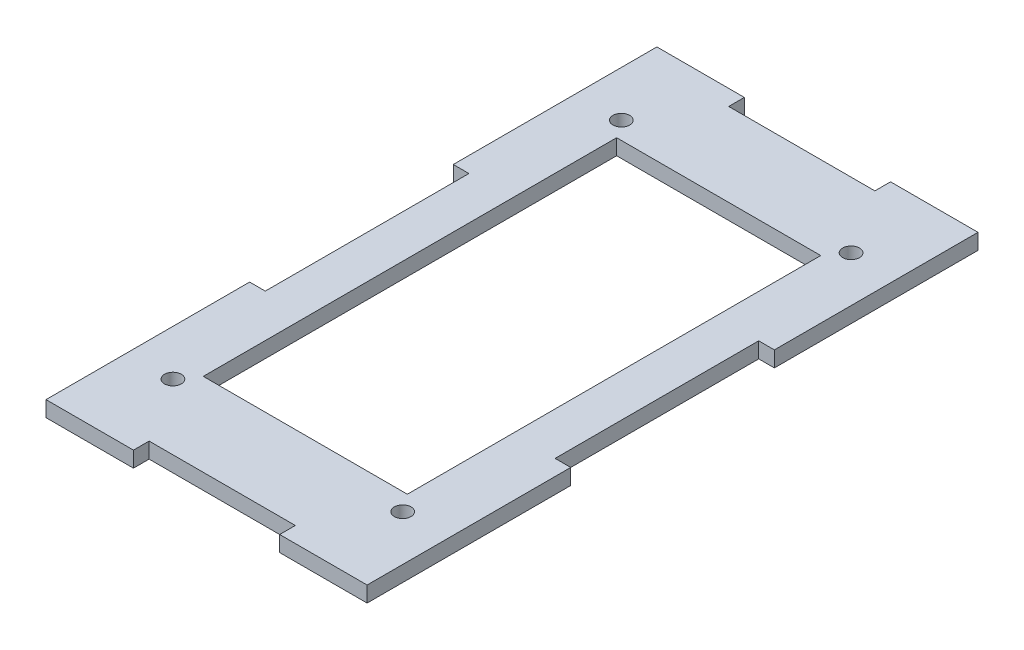
ISO-10303-21;
HEADER;
FILE_DESCRIPTION(('STEP AP214'),'2;1');
FILE_NAME('part.step','',(''),(''),'','','');
FILE_SCHEMA(('AUTOMOTIVE_DESIGN { 1 0 10303 214 1 1 1 1 }'));
ENDSEC;
DATA;
#1=APPLICATION_CONTEXT('core data for automotive mechanical design processes');
#2=APPLICATION_PROTOCOL_DEFINITION('international standard','automotive_design',2000,#1);
#3=PRODUCT_CONTEXT('',#1,'mechanical');
#4=PRODUCT('Part','Part','',(#3));
#5=PRODUCT_RELATED_PRODUCT_CATEGORY('part','',(#4));
#6=PRODUCT_DEFINITION_FORMATION('','',#4);
#7=PRODUCT_DEFINITION_CONTEXT('part definition',#1,'design');
#8=PRODUCT_DEFINITION('design','',#6,#7);
#9=PRODUCT_DEFINITION_SHAPE('','',#8);
#10=(LENGTH_UNIT() NAMED_UNIT(*) SI_UNIT(.MILLI.,.METRE.));
#11=(NAMED_UNIT(*) PLANE_ANGLE_UNIT() SI_UNIT($,.RADIAN.));
#12=(NAMED_UNIT(*) SI_UNIT($,.STERADIAN.) SOLID_ANGLE_UNIT());
#13=UNCERTAINTY_MEASURE_WITH_UNIT(LENGTH_MEASURE(1.E-05),#10,'distance_accuracy_value','');
#14=(GEOMETRIC_REPRESENTATION_CONTEXT(3) GLOBAL_UNCERTAINTY_ASSIGNED_CONTEXT((#13)) GLOBAL_UNIT_ASSIGNED_CONTEXT((#10,
#11,#12)) REPRESENTATION_CONTEXT('',''));
#15=CARTESIAN_POINT('',(0.,0.,0.));
#16=DIRECTION('',(0.,0.,1.));
#17=DIRECTION('',(1.,0.,0.));
#18=AXIS2_PLACEMENT_3D('',#15,#16,#17);
#19=CARTESIAN_POINT('',(0.,3.,0.));
#20=DIRECTION('',(0.,1.,0.));
#21=DIRECTION('',(0.,0.,1.));
#22=AXIS2_PLACEMENT_3D('',#19,#20,#21);
#23=PLANE('',#22);
#24=DIRECTION('',(0.,0.,1.));
#25=VECTOR('',#24,1.);
#26=CARTESIAN_POINT('',(-19.545,3.,-39.585));
#27=LINE('',#26,#25);
#28=CARTESIAN_POINT('',(-19.545,3.,-39.585));
#29=VERTEX_POINT('',#28);
#30=CARTESIAN_POINT('',(-19.545,3.,39.585));
#31=VERTEX_POINT('',#30);
#32=EDGE_CURVE('E48',#29,#31,#27,.T.);
#33=ORIENTED_EDGE('',*,*,#32,.F.);
#34=DIRECTION('',(-1.,0.,0.));
#35=VECTOR('',#34,1.);
#36=CARTESIAN_POINT('',(-19.545,3.,-39.585));
#37=LINE('',#36,#35);
#38=CARTESIAN_POINT('',(19.545,3.,-39.585));
#39=VERTEX_POINT('',#38);
#40=EDGE_CURVE('E212',#39,#29,#37,.T.);
#41=ORIENTED_EDGE('',*,*,#40,.F.);
#42=DIRECTION('',(0.,0.,-1.));
#43=VECTOR('',#42,1.);
#44=CARTESIAN_POINT('',(19.545,3.,-39.585));
#45=LINE('',#44,#43);
#46=CARTESIAN_POINT('',(19.545,3.,39.585));
#47=VERTEX_POINT('',#46);
#48=EDGE_CURVE('E215',#47,#39,#45,.T.);
#49=ORIENTED_EDGE('',*,*,#48,.F.);
#50=DIRECTION('',(1.,0.,0.));
#51=VECTOR('',#50,1.);
#52=CARTESIAN_POINT('',(-19.545,3.,39.585));
#53=LINE('',#52,#51);
#54=EDGE_CURVE('E221',#31,#47,#53,.T.);
#55=ORIENTED_EDGE('',*,*,#54,.F.);
#56=EDGE_LOOP('',(#33,#41,#49,#55));
#57=FACE_BOUND('',#56,.T.);
#58=CARTESIAN_POINT('',(22.,3.,-42.94));
#59=DIRECTION('',(0.,1.,0.));
#60=DIRECTION('',(0.,0.,1.));
#61=AXIS2_PLACEMENT_3D('',#58,#59,#60);
#62=CIRCLE('',#61,1.60920482237498);
#63=CARTESIAN_POINT('',(22.,3.,-41.330795177625));
#64=VERTEX_POINT('',#63);
#65=EDGE_CURVE('E237',#64,#64,#62,.T.);
#66=ORIENTED_EDGE('',*,*,#65,.F.);
#67=EDGE_LOOP('',(#66));
#68=FACE_BOUND('',#67,.T.);
#69=CARTESIAN_POINT('',(-22.,3.,42.94));
#70=DIRECTION('',(0.,1.,0.));
#71=DIRECTION('',(0.,0.,1.));
#72=AXIS2_PLACEMENT_3D('',#69,#70,#71);
#73=CIRCLE('',#72,1.60920482237498);
#74=CARTESIAN_POINT('',(-22.,3.,44.549204822375));
#75=VERTEX_POINT('',#74);
#76=EDGE_CURVE('E249',#75,#75,#73,.T.);
#77=ORIENTED_EDGE('',*,*,#76,.F.);
#78=EDGE_LOOP('',(#77));
#79=FACE_BOUND('',#78,.T.);
#80=DIRECTION('',(-1.,0.,0.));
#81=VECTOR('',#80,1.);
#82=CARTESIAN_POINT('',(30.75,3.,-58.5));
#83=LINE('',#82,#81);
#84=CARTESIAN_POINT('',(30.75,3.,-58.5));
#85=VERTEX_POINT('',#84);
#86=CARTESIAN_POINT('',(14.,3.,-58.5));
#87=VERTEX_POINT('',#86);
#88=EDGE_CURVE('E255',#85,#87,#83,.T.);
#89=ORIENTED_EDGE('',*,*,#88,.T.);
#90=DIRECTION('',(0.,0.,1.));
#91=VECTOR('',#90,1.);
#92=CARTESIAN_POINT('',(14.,3.,-58.5));
#93=LINE('',#92,#91);
#94=CARTESIAN_POINT('',(14.,3.,-55.5));
#95=VERTEX_POINT('',#94);
#96=EDGE_CURVE('E258',#87,#95,#93,.T.);
#97=ORIENTED_EDGE('',*,*,#96,.T.);
#98=DIRECTION('',(-1.,0.,0.));
#99=VECTOR('',#98,1.);
#100=CARTESIAN_POINT('',(14.,3.,-55.5));
#101=LINE('',#100,#99);
#102=CARTESIAN_POINT('',(-14.,3.,-55.5));
#103=VERTEX_POINT('',#102);
#104=EDGE_CURVE('E261',#95,#103,#101,.T.);
#105=ORIENTED_EDGE('',*,*,#104,.T.);
#106=DIRECTION('',(0.,0.,-1.));
#107=VECTOR('',#106,1.);
#108=CARTESIAN_POINT('',(-14.,3.,-55.5));
#109=LINE('',#108,#107);
#110=CARTESIAN_POINT('',(-14.,3.,-58.5));
#111=VERTEX_POINT('',#110);
#112=EDGE_CURVE('E263',#103,#111,#109,.T.);
#113=ORIENTED_EDGE('',*,*,#112,.T.);
#114=DIRECTION('',(-1.,0.,0.));
#115=VECTOR('',#114,1.);
#116=CARTESIAN_POINT('',(-14.,3.,-58.5));
#117=LINE('',#116,#115);
#118=CARTESIAN_POINT('',(-30.75,3.,-58.5));
#119=VERTEX_POINT('',#118);
#120=EDGE_CURVE('E265',#111,#119,#117,.T.);
#121=ORIENTED_EDGE('',*,*,#120,.T.);
#122=DIRECTION('',(0.,0.,1.));
#123=VECTOR('',#122,1.);
#124=CARTESIAN_POINT('',(-30.75,3.,-58.5));
#125=LINE('',#124,#123);
#126=CARTESIAN_POINT('',(-30.75,3.,-19.5));
#127=VERTEX_POINT('',#126);
#128=EDGE_CURVE('E267',#119,#127,#125,.T.);
#129=ORIENTED_EDGE('',*,*,#128,.T.);
#130=DIRECTION('',(1.,0.,0.));
#131=VECTOR('',#130,1.);
#132=CARTESIAN_POINT('',(-30.75,3.,-19.5));
#133=LINE('',#132,#131);
#134=CARTESIAN_POINT('',(-27.75,3.,-19.5));
#135=VERTEX_POINT('',#134);
#136=EDGE_CURVE('E269',#127,#135,#133,.T.);
#137=ORIENTED_EDGE('',*,*,#136,.T.);
#138=DIRECTION('',(0.,0.,1.));
#139=VECTOR('',#138,1.);
#140=CARTESIAN_POINT('',(-27.75,3.,-19.5));
#141=LINE('',#140,#139);
#142=CARTESIAN_POINT('',(-27.75,3.,19.5));
#143=VERTEX_POINT('',#142);
#144=EDGE_CURVE('E271',#135,#143,#141,.T.);
#145=ORIENTED_EDGE('',*,*,#144,.T.);
#146=DIRECTION('',(-1.,0.,0.));
#147=VECTOR('',#146,1.);
#148=CARTESIAN_POINT('',(-27.75,3.,19.5));
#149=LINE('',#148,#147);
#150=CARTESIAN_POINT('',(-30.75,3.,19.5));
#151=VERTEX_POINT('',#150);
#152=EDGE_CURVE('E273',#143,#151,#149,.T.);
#153=ORIENTED_EDGE('',*,*,#152,.T.);
#154=DIRECTION('',(0.,0.,1.));
#155=VECTOR('',#154,1.);
#156=CARTESIAN_POINT('',(-30.75,3.,19.5));
#157=LINE('',#156,#155);
#158=CARTESIAN_POINT('',(-30.75,3.,58.5));
#159=VERTEX_POINT('',#158);
#160=EDGE_CURVE('E275',#151,#159,#157,.T.);
#161=ORIENTED_EDGE('',*,*,#160,.T.);
#162=DIRECTION('',(1.,0.,0.));
#163=VECTOR('',#162,1.);
#164=CARTESIAN_POINT('',(-30.75,3.,58.5));
#165=LINE('',#164,#163);
#166=CARTESIAN_POINT('',(-14.,3.,58.5));
#167=VERTEX_POINT('',#166);
#168=EDGE_CURVE('E277',#159,#167,#165,.T.);
#169=ORIENTED_EDGE('',*,*,#168,.T.);
#170=DIRECTION('',(0.,0.,-1.));
#171=VECTOR('',#170,1.);
#172=CARTESIAN_POINT('',(-14.,3.,58.5));
#173=LINE('',#172,#171);
#174=CARTESIAN_POINT('',(-14.,3.,55.5));
#175=VERTEX_POINT('',#174);
#176=EDGE_CURVE('E279',#167,#175,#173,.T.);
#177=ORIENTED_EDGE('',*,*,#176,.T.);
#178=DIRECTION('',(1.,0.,0.));
#179=VECTOR('',#178,1.);
#180=CARTESIAN_POINT('',(-14.,3.,55.5));
#181=LINE('',#180,#179);
#182=CARTESIAN_POINT('',(14.,3.,55.5));
#183=VERTEX_POINT('',#182);
#184=EDGE_CURVE('E281',#175,#183,#181,.T.);
#185=ORIENTED_EDGE('',*,*,#184,.T.);
#186=DIRECTION('',(0.,0.,1.));
#187=VECTOR('',#186,1.);
#188=CARTESIAN_POINT('',(14.,3.,55.5));
#189=LINE('',#188,#187);
#190=CARTESIAN_POINT('',(14.,3.,58.5));
#191=VERTEX_POINT('',#190);
#192=EDGE_CURVE('E283',#183,#191,#189,.T.);
#193=ORIENTED_EDGE('',*,*,#192,.T.);
#194=DIRECTION('',(1.,0.,0.));
#195=VECTOR('',#194,1.);
#196=CARTESIAN_POINT('',(14.,3.,58.5));
#197=LINE('',#196,#195);
#198=CARTESIAN_POINT('',(30.75,3.,58.5));
#199=VERTEX_POINT('',#198);
#200=EDGE_CURVE('E285',#191,#199,#197,.T.);
#201=ORIENTED_EDGE('',*,*,#200,.T.);
#202=DIRECTION('',(0.,0.,-1.));
#203=VECTOR('',#202,1.);
#204=CARTESIAN_POINT('',(30.75,3.,58.5));
#205=LINE('',#204,#203);
#206=CARTESIAN_POINT('',(30.75,3.,19.5));
#207=VERTEX_POINT('',#206);
#208=EDGE_CURVE('E287',#199,#207,#205,.T.);
#209=ORIENTED_EDGE('',*,*,#208,.T.);
#210=DIRECTION('',(-1.,0.,0.));
#211=VECTOR('',#210,1.);
#212=CARTESIAN_POINT('',(30.75,3.,19.5));
#213=LINE('',#212,#211);
#214=CARTESIAN_POINT('',(27.75,3.,19.5));
#215=VERTEX_POINT('',#214);
#216=EDGE_CURVE('E289',#207,#215,#213,.T.);
#217=ORIENTED_EDGE('',*,*,#216,.T.);
#218=DIRECTION('',(0.,0.,-1.));
#219=VECTOR('',#218,1.);
#220=CARTESIAN_POINT('',(27.75,3.,19.5));
#221=LINE('',#220,#219);
#222=CARTESIAN_POINT('',(27.75,3.,-19.5));
#223=VERTEX_POINT('',#222);
#224=EDGE_CURVE('E291',#215,#223,#221,.T.);
#225=ORIENTED_EDGE('',*,*,#224,.T.);
#226=DIRECTION('',(1.,0.,0.));
#227=VECTOR('',#226,1.);
#228=CARTESIAN_POINT('',(27.75,3.,-19.5));
#229=LINE('',#228,#227);
#230=CARTESIAN_POINT('',(30.75,3.,-19.5));
#231=VERTEX_POINT('',#230);
#232=EDGE_CURVE('E293',#223,#231,#229,.T.);
#233=ORIENTED_EDGE('',*,*,#232,.T.);
#234=DIRECTION('',(0.,0.,-1.));
#235=VECTOR('',#234,1.);
#236=CARTESIAN_POINT('',(30.75,3.,-19.5));
#237=LINE('',#236,#235);
#238=EDGE_CURVE('E295',#231,#85,#237,.T.);
#239=ORIENTED_EDGE('',*,*,#238,.T.);
#240=EDGE_LOOP('',(#89,#97,#105,#113,#121,#129,#137,#145,#153,#161,#169,#177,#185,#193,#201,
#209,#217,#225,#233,#239));
#241=FACE_BOUND('',#240,.T.);
#242=CARTESIAN_POINT('',(22.,3.,42.94));
#243=DIRECTION('',(0.,1.,0.));
#244=DIRECTION('',(0.,0.,1.));
#245=AXIS2_PLACEMENT_3D('',#242,#243,#244);
#246=CIRCLE('',#245,1.60920482237498);
#247=CARTESIAN_POINT('',(22.,3.,44.549204822375));
#248=VERTEX_POINT('',#247);
#249=EDGE_CURVE('E243',#248,#248,#246,.T.);
#250=ORIENTED_EDGE('',*,*,#249,.F.);
#251=EDGE_LOOP('',(#250));
#252=FACE_BOUND('',#251,.T.);
#253=CARTESIAN_POINT('',(-22.,3.,-42.94));
#254=DIRECTION('',(0.,1.,0.));
#255=DIRECTION('',(0.,0.,1.));
#256=AXIS2_PLACEMENT_3D('',#253,#254,#255);
#257=CIRCLE('',#256,1.60920482237498);
#258=CARTESIAN_POINT('',(-22.,3.,-41.330795177625));
#259=VERTEX_POINT('',#258);
#260=EDGE_CURVE('E231',#259,#259,#257,.T.);
#261=ORIENTED_EDGE('',*,*,#260,.F.);
#262=EDGE_LOOP('',(#261));
#263=FACE_BOUND('',#262,.T.);
#264=ADVANCED_FACE('F33',(#57,#68,#79,#241,#252,#263),#23,.T.);
#265=CARTESIAN_POINT('',(0.,0.,0.));
#266=DIRECTION('',(0.,1.,0.));
#267=DIRECTION('',(0.,0.,1.));
#268=AXIS2_PLACEMENT_3D('',#265,#266,#267);
#269=PLANE('',#268);
#270=DIRECTION('',(-1.,0.,0.));
#271=VECTOR('',#270,1.);
#272=CARTESIAN_POINT('',(-19.545,0.,-39.585));
#273=LINE('',#272,#271);
#274=CARTESIAN_POINT('',(19.545,0.,-39.585));
#275=VERTEX_POINT('',#274);
#276=CARTESIAN_POINT('',(-19.545,0.,-39.585));
#277=VERTEX_POINT('',#276);
#278=EDGE_CURVE('E202',#275,#277,#273,.T.);
#279=ORIENTED_EDGE('',*,*,#278,.T.);
#280=DIRECTION('',(0.,0.,1.));
#281=VECTOR('',#280,1.);
#282=CARTESIAN_POINT('',(-19.545,0.,-39.585));
#283=LINE('',#282,#281);
#284=CARTESIAN_POINT('',(-19.545,0.,39.585));
#285=VERTEX_POINT('',#284);
#286=EDGE_CURVE('E196',#277,#285,#283,.T.);
#287=ORIENTED_EDGE('',*,*,#286,.T.);
#288=DIRECTION('',(1.,0.,0.));
#289=VECTOR('',#288,1.);
#290=CARTESIAN_POINT('',(-19.545,0.,39.585));
#291=LINE('',#290,#289);
#292=CARTESIAN_POINT('',(19.545,0.,39.585));
#293=VERTEX_POINT('',#292);
#294=EDGE_CURVE('E205',#285,#293,#291,.T.);
#295=ORIENTED_EDGE('',*,*,#294,.T.);
#296=DIRECTION('',(0.,0.,-1.));
#297=VECTOR('',#296,1.);
#298=CARTESIAN_POINT('',(19.545,0.,-39.585));
#299=LINE('',#298,#297);
#300=EDGE_CURVE('E56',#293,#275,#299,.T.);
#301=ORIENTED_EDGE('',*,*,#300,.T.);
#302=EDGE_LOOP('',(#279,#287,#295,#301));
#303=FACE_BOUND('',#302,.T.);
#304=DIRECTION('',(-1.,0.,0.));
#305=VECTOR('',#304,1.);
#306=CARTESIAN_POINT('',(30.75,0.,-58.5));
#307=LINE('',#306,#305);
#308=CARTESIAN_POINT('',(30.75,0.,-58.5));
#309=VERTEX_POINT('',#308);
#310=CARTESIAN_POINT('',(14.,0.,-58.5));
#311=VERTEX_POINT('',#310);
#312=EDGE_CURVE('E252',#309,#311,#307,.T.);
#313=ORIENTED_EDGE('',*,*,#312,.F.);
#314=DIRECTION('',(0.,0.,-1.));
#315=VECTOR('',#314,1.);
#316=CARTESIAN_POINT('',(30.75,0.,-19.5));
#317=LINE('',#316,#315);
#318=CARTESIAN_POINT('',(30.75,0.,-19.5));
#319=VERTEX_POINT('',#318);
#320=EDGE_CURVE('E259',#319,#309,#317,.T.);
#321=ORIENTED_EDGE('',*,*,#320,.F.);
#322=DIRECTION('',(1.,0.,0.));
#323=VECTOR('',#322,1.);
#324=CARTESIAN_POINT('',(27.75,0.,-19.5));
#325=LINE('',#324,#323);
#326=CARTESIAN_POINT('',(27.75,0.,-19.5));
#327=VERTEX_POINT('',#326);
#328=EDGE_CURVE('E334',#327,#319,#325,.T.);
#329=ORIENTED_EDGE('',*,*,#328,.F.);
#330=DIRECTION('',(0.,0.,-1.));
#331=VECTOR('',#330,1.);
#332=CARTESIAN_POINT('',(27.75,0.,19.5));
#333=LINE('',#332,#331);
#334=CARTESIAN_POINT('',(27.75,0.,19.5));
#335=VERTEX_POINT('',#334);
#336=EDGE_CURVE('E332',#335,#327,#333,.T.);
#337=ORIENTED_EDGE('',*,*,#336,.F.);
#338=DIRECTION('',(-1.,0.,0.));
#339=VECTOR('',#338,1.);
#340=CARTESIAN_POINT('',(30.75,0.,19.5));
#341=LINE('',#340,#339);
#342=CARTESIAN_POINT('',(30.75,0.,19.5));
#343=VERTEX_POINT('',#342);
#344=EDGE_CURVE('E330',#343,#335,#341,.T.);
#345=ORIENTED_EDGE('',*,*,#344,.F.);
#346=DIRECTION('',(0.,0.,-1.));
#347=VECTOR('',#346,1.);
#348=CARTESIAN_POINT('',(30.75,0.,58.5));
#349=LINE('',#348,#347);
#350=CARTESIAN_POINT('',(30.75,0.,58.5));
#351=VERTEX_POINT('',#350);
#352=EDGE_CURVE('E328',#351,#343,#349,.T.);
#353=ORIENTED_EDGE('',*,*,#352,.F.);
#354=DIRECTION('',(1.,0.,0.));
#355=VECTOR('',#354,1.);
#356=CARTESIAN_POINT('',(14.,0.,58.5));
#357=LINE('',#356,#355);
#358=CARTESIAN_POINT('',(14.,0.,58.5));
#359=VERTEX_POINT('',#358);
#360=EDGE_CURVE('E326',#359,#351,#357,.T.);
#361=ORIENTED_EDGE('',*,*,#360,.F.);
#362=DIRECTION('',(0.,0.,1.));
#363=VECTOR('',#362,1.);
#364=CARTESIAN_POINT('',(14.,0.,55.5));
#365=LINE('',#364,#363);
#366=CARTESIAN_POINT('',(14.,0.,55.5));
#367=VERTEX_POINT('',#366);
#368=EDGE_CURVE('E324',#367,#359,#365,.T.);
#369=ORIENTED_EDGE('',*,*,#368,.F.);
#370=DIRECTION('',(1.,0.,0.));
#371=VECTOR('',#370,1.);
#372=CARTESIAN_POINT('',(-14.,0.,55.5));
#373=LINE('',#372,#371);
#374=CARTESIAN_POINT('',(-14.,0.,55.5));
#375=VERTEX_POINT('',#374);
#376=EDGE_CURVE('E322',#375,#367,#373,.T.);
#377=ORIENTED_EDGE('',*,*,#376,.F.);
#378=DIRECTION('',(0.,0.,-1.));
#379=VECTOR('',#378,1.);
#380=CARTESIAN_POINT('',(-14.,0.,58.5));
#381=LINE('',#380,#379);
#382=CARTESIAN_POINT('',(-14.,0.,58.5));
#383=VERTEX_POINT('',#382);
#384=EDGE_CURVE('E320',#383,#375,#381,.T.);
#385=ORIENTED_EDGE('',*,*,#384,.F.);
#386=DIRECTION('',(1.,0.,0.));
#387=VECTOR('',#386,1.);
#388=CARTESIAN_POINT('',(-30.75,0.,58.5));
#389=LINE('',#388,#387);
#390=CARTESIAN_POINT('',(-30.75,0.,58.5));
#391=VERTEX_POINT('',#390);
#392=EDGE_CURVE('E318',#391,#383,#389,.T.);
#393=ORIENTED_EDGE('',*,*,#392,.F.);
#394=DIRECTION('',(0.,0.,1.));
#395=VECTOR('',#394,1.);
#396=CARTESIAN_POINT('',(-30.75,0.,19.5));
#397=LINE('',#396,#395);
#398=CARTESIAN_POINT('',(-30.75,0.,19.5));
#399=VERTEX_POINT('',#398);
#400=EDGE_CURVE('E316',#399,#391,#397,.T.);
#401=ORIENTED_EDGE('',*,*,#400,.F.);
#402=DIRECTION('',(-1.,0.,0.));
#403=VECTOR('',#402,1.);
#404=CARTESIAN_POINT('',(-27.75,0.,19.5));
#405=LINE('',#404,#403);
#406=CARTESIAN_POINT('',(-27.75,0.,19.5));
#407=VERTEX_POINT('',#406);
#408=EDGE_CURVE('E314',#407,#399,#405,.T.);
#409=ORIENTED_EDGE('',*,*,#408,.F.);
#410=DIRECTION('',(0.,0.,1.));
#411=VECTOR('',#410,1.);
#412=CARTESIAN_POINT('',(-27.75,0.,-19.5));
#413=LINE('',#412,#411);
#414=CARTESIAN_POINT('',(-27.75,0.,-19.5));
#415=VERTEX_POINT('',#414);
#416=EDGE_CURVE('E312',#415,#407,#413,.T.);
#417=ORIENTED_EDGE('',*,*,#416,.F.);
#418=DIRECTION('',(1.,0.,0.));
#419=VECTOR('',#418,1.);
#420=CARTESIAN_POINT('',(-30.75,0.,-19.5));
#421=LINE('',#420,#419);
#422=CARTESIAN_POINT('',(-30.75,0.,-19.5));
#423=VERTEX_POINT('',#422);
#424=EDGE_CURVE('E310',#423,#415,#421,.T.);
#425=ORIENTED_EDGE('',*,*,#424,.F.);
#426=DIRECTION('',(0.,0.,1.));
#427=VECTOR('',#426,1.);
#428=CARTESIAN_POINT('',(-30.75,0.,-58.5));
#429=LINE('',#428,#427);
#430=CARTESIAN_POINT('',(-30.75,0.,-58.5));
#431=VERTEX_POINT('',#430);
#432=EDGE_CURVE('E308',#431,#423,#429,.T.);
#433=ORIENTED_EDGE('',*,*,#432,.F.);
#434=DIRECTION('',(-1.,0.,0.));
#435=VECTOR('',#434,1.);
#436=CARTESIAN_POINT('',(-14.,0.,-58.5));
#437=LINE('',#436,#435);
#438=CARTESIAN_POINT('',(-14.,0.,-58.5));
#439=VERTEX_POINT('',#438);
#440=EDGE_CURVE('E306',#439,#431,#437,.T.);
#441=ORIENTED_EDGE('',*,*,#440,.F.);
#442=DIRECTION('',(0.,0.,-1.));
#443=VECTOR('',#442,1.);
#444=CARTESIAN_POINT('',(-14.,0.,-55.5));
#445=LINE('',#444,#443);
#446=CARTESIAN_POINT('',(-14.,0.,-55.5));
#447=VERTEX_POINT('',#446);
#448=EDGE_CURVE('E304',#447,#439,#445,.T.);
#449=ORIENTED_EDGE('',*,*,#448,.F.);
#450=DIRECTION('',(-1.,0.,0.));
#451=VECTOR('',#450,1.);
#452=CARTESIAN_POINT('',(14.,0.,-55.5));
#453=LINE('',#452,#451);
#454=CARTESIAN_POINT('',(14.,0.,-55.5));
#455=VERTEX_POINT('',#454);
#456=EDGE_CURVE('E302',#455,#447,#453,.T.);
#457=ORIENTED_EDGE('',*,*,#456,.F.);
#458=DIRECTION('',(0.,0.,1.));
#459=VECTOR('',#458,1.);
#460=CARTESIAN_POINT('',(14.,0.,-58.5));
#461=LINE('',#460,#459);
#462=EDGE_CURVE('E300',#311,#455,#461,.T.);
#463=ORIENTED_EDGE('',*,*,#462,.F.);
#464=EDGE_LOOP('',(#313,#321,#329,#337,#345,#353,#361,#369,#377,#385,#393,#401,#409,#417,#425,
#433,#441,#449,#457,#463));
#465=FACE_BOUND('',#464,.T.);
#466=CARTESIAN_POINT('',(-22.,0.,42.94));
#467=DIRECTION('',(0.,1.,0.));
#468=DIRECTION('',(0.,0.,1.));
#469=AXIS2_PLACEMENT_3D('',#466,#467,#468);
#470=CIRCLE('',#469,1.60920482237498);
#471=CARTESIAN_POINT('',(-22.,0.,44.549204822375));
#472=VERTEX_POINT('',#471);
#473=EDGE_CURVE('E246',#472,#472,#470,.T.);
#474=ORIENTED_EDGE('',*,*,#473,.T.);
#475=EDGE_LOOP('',(#474));
#476=FACE_BOUND('',#475,.T.);
#477=CARTESIAN_POINT('',(22.,0.,42.94));
#478=DIRECTION('',(0.,1.,0.));
#479=DIRECTION('',(0.,0.,1.));
#480=AXIS2_PLACEMENT_3D('',#477,#478,#479);
#481=CIRCLE('',#480,1.60920482237498);
#482=CARTESIAN_POINT('',(22.,0.,44.549204822375));
#483=VERTEX_POINT('',#482);
#484=EDGE_CURVE('E240',#483,#483,#481,.T.);
#485=ORIENTED_EDGE('',*,*,#484,.T.);
#486=EDGE_LOOP('',(#485));
#487=FACE_BOUND('',#486,.T.);
#488=CARTESIAN_POINT('',(22.,0.,-42.94));
#489=DIRECTION('',(0.,1.,0.));
#490=DIRECTION('',(0.,0.,1.));
#491=AXIS2_PLACEMENT_3D('',#488,#489,#490);
#492=CIRCLE('',#491,1.60920482237498);
#493=CARTESIAN_POINT('',(22.,0.,-41.330795177625));
#494=VERTEX_POINT('',#493);
#495=EDGE_CURVE('E234',#494,#494,#492,.T.);
#496=ORIENTED_EDGE('',*,*,#495,.T.);
#497=EDGE_LOOP('',(#496));
#498=FACE_BOUND('',#497,.T.);
#499=CARTESIAN_POINT('',(-22.,0.,-42.94));
#500=DIRECTION('',(0.,1.,0.));
#501=DIRECTION('',(0.,0.,1.));
#502=AXIS2_PLACEMENT_3D('',#499,#500,#501);
#503=CIRCLE('',#502,1.60920482237498);
#504=CARTESIAN_POINT('',(-22.,0.,-41.330795177625));
#505=VERTEX_POINT('',#504);
#506=EDGE_CURVE('E227',#505,#505,#503,.T.);
#507=ORIENTED_EDGE('',*,*,#506,.T.);
#508=EDGE_LOOP('',(#507));
#509=FACE_BOUND('',#508,.T.);
#510=ADVANCED_FACE('F209',(#303,#465,#476,#487,#498,#509),#269,.F.);
#511=CARTESIAN_POINT('',(30.75,3.,-58.5));
#512=DIRECTION('',(0.,0.,1.));
#513=DIRECTION('',(1.,0.,0.));
#514=AXIS2_PLACEMENT_3D('',#511,#512,#513);
#515=PLANE('',#514);
#516=ORIENTED_EDGE('',*,*,#312,.T.);
#517=DIRECTION('',(0.,-1.,0.));
#518=VECTOR('',#517,1.);
#519=CARTESIAN_POINT('',(14.,3.,-58.5));
#520=LINE('',#519,#518);
#521=EDGE_CURVE('E11',#87,#311,#520,.T.);
#522=ORIENTED_EDGE('',*,*,#521,.F.);
#523=ORIENTED_EDGE('',*,*,#88,.F.);
#524=DIRECTION('',(0.,-1.,0.));
#525=VECTOR('',#524,1.);
#526=CARTESIAN_POINT('',(30.75,3.,-58.5));
#527=LINE('',#526,#525);
#528=EDGE_CURVE('E297',#85,#309,#527,.T.);
#529=ORIENTED_EDGE('',*,*,#528,.T.);
#530=EDGE_LOOP('',(#516,#522,#523,#529));
#531=FACE_BOUND('',#530,.T.);
#532=ADVANCED_FACE('F35',(#531),#515,.F.);
#533=CARTESIAN_POINT('',(14.,3.,-58.5));
#534=DIRECTION('',(1.,0.,0.));
#535=DIRECTION('',(0.,0.,-1.));
#536=AXIS2_PLACEMENT_3D('',#533,#534,#535);
#537=PLANE('',#536);
#538=ORIENTED_EDGE('',*,*,#462,.T.);
#539=DIRECTION('',(0.,-1.,0.));
#540=VECTOR('',#539,1.);
#541=CARTESIAN_POINT('',(14.,3.,-55.5));
#542=LINE('',#541,#540);
#543=EDGE_CURVE('E41',#95,#455,#542,.T.);
#544=ORIENTED_EDGE('',*,*,#543,.F.);
#545=ORIENTED_EDGE('',*,*,#96,.F.);
#546=ORIENTED_EDGE('',*,*,#521,.T.);
#547=EDGE_LOOP('',(#538,#544,#545,#546));
#548=FACE_BOUND('',#547,.T.);
#549=ADVANCED_FACE('F416',(#548),#537,.F.);
#550=CARTESIAN_POINT('',(14.,3.,-55.5));
#551=DIRECTION('',(0.,0.,1.));
#552=DIRECTION('',(1.,0.,0.));
#553=AXIS2_PLACEMENT_3D('',#550,#551,#552);
#554=PLANE('',#553);
#555=ORIENTED_EDGE('',*,*,#456,.T.);
#556=DIRECTION('',(0.,-1.,0.));
#557=VECTOR('',#556,1.);
#558=CARTESIAN_POINT('',(-14.,3.,-55.5));
#559=LINE('',#558,#557);
#560=EDGE_CURVE('E387',#103,#447,#559,.T.);
#561=ORIENTED_EDGE('',*,*,#560,.F.);
#562=ORIENTED_EDGE('',*,*,#104,.F.);
#563=ORIENTED_EDGE('',*,*,#543,.T.);
#564=EDGE_LOOP('',(#555,#561,#562,#563));
#565=FACE_BOUND('',#564,.T.);
#566=ADVANCED_FACE('F394',(#565),#554,.F.);
#567=CARTESIAN_POINT('',(-14.,3.,-55.5));
#568=DIRECTION('',(-1.,0.,0.));
#569=DIRECTION('',(0.,0.,1.));
#570=AXIS2_PLACEMENT_3D('',#567,#568,#569);
#571=PLANE('',#570);
#572=ORIENTED_EDGE('',*,*,#448,.T.);
#573=DIRECTION('',(0.,-1.,0.));
#574=VECTOR('',#573,1.);
#575=CARTESIAN_POINT('',(-14.,3.,-58.5));
#576=LINE('',#575,#574);
#577=EDGE_CURVE('E384',#111,#439,#576,.T.);
#578=ORIENTED_EDGE('',*,*,#577,.F.);
#579=ORIENTED_EDGE('',*,*,#112,.F.);
#580=ORIENTED_EDGE('',*,*,#560,.T.);
#581=EDGE_LOOP('',(#572,#578,#579,#580));
#582=FACE_BOUND('',#581,.T.);
#583=ADVANCED_FACE('F404',(#582),#571,.F.);
#584=CARTESIAN_POINT('',(-14.,3.,-58.5));
#585=DIRECTION('',(0.,0.,1.));
#586=DIRECTION('',(1.,0.,0.));
#587=AXIS2_PLACEMENT_3D('',#584,#585,#586);
#588=PLANE('',#587);
#589=ORIENTED_EDGE('',*,*,#440,.T.);
#590=DIRECTION('',(0.,-1.,0.));
#591=VECTOR('',#590,1.);
#592=CARTESIAN_POINT('',(-30.75,3.,-58.5));
#593=LINE('',#592,#591);
#594=EDGE_CURVE('E381',#119,#431,#593,.T.);
#595=ORIENTED_EDGE('',*,*,#594,.F.);
#596=ORIENTED_EDGE('',*,*,#120,.F.);
#597=ORIENTED_EDGE('',*,*,#577,.T.);
#598=EDGE_LOOP('',(#589,#595,#596,#597));
#599=FACE_BOUND('',#598,.T.);
#600=ADVANCED_FACE('F408',(#599),#588,.F.);
#601=CARTESIAN_POINT('',(-30.75,3.,-58.5));
#602=DIRECTION('',(1.,0.,0.));
#603=DIRECTION('',(0.,0.,-1.));
#604=AXIS2_PLACEMENT_3D('',#601,#602,#603);
#605=PLANE('',#604);
#606=ORIENTED_EDGE('',*,*,#432,.T.);
#607=DIRECTION('',(0.,-1.,0.));
#608=VECTOR('',#607,1.);
#609=CARTESIAN_POINT('',(-30.75,3.,-19.5));
#610=LINE('',#609,#608);
#611=EDGE_CURVE('E378',#127,#423,#610,.T.);
#612=ORIENTED_EDGE('',*,*,#611,.F.);
#613=ORIENTED_EDGE('',*,*,#128,.F.);
#614=ORIENTED_EDGE('',*,*,#594,.T.);
#615=EDGE_LOOP('',(#606,#612,#613,#614));
#616=FACE_BOUND('',#615,.T.);
#617=ADVANCED_FACE('F489',(#616),#605,.F.);
#618=CARTESIAN_POINT('',(-30.75,3.,-19.5));
#619=DIRECTION('',(0.,0.,-1.));
#620=DIRECTION('',(-1.,0.,0.));
#621=AXIS2_PLACEMENT_3D('',#618,#619,#620);
#622=PLANE('',#621);
#623=ORIENTED_EDGE('',*,*,#424,.T.);
#624=DIRECTION('',(0.,-1.,0.));
#625=VECTOR('',#624,1.);
#626=CARTESIAN_POINT('',(-27.75,3.,-19.5));
#627=LINE('',#626,#625);
#628=EDGE_CURVE('E375',#135,#415,#627,.T.);
#629=ORIENTED_EDGE('',*,*,#628,.F.);
#630=ORIENTED_EDGE('',*,*,#136,.F.);
#631=ORIENTED_EDGE('',*,*,#611,.T.);
#632=EDGE_LOOP('',(#623,#629,#630,#631));
#633=FACE_BOUND('',#632,.T.);
#634=ADVANCED_FACE('F487',(#633),#622,.F.);
#635=CARTESIAN_POINT('',(-27.75,3.,-19.5));
#636=DIRECTION('',(1.,0.,0.));
#637=DIRECTION('',(0.,0.,-1.));
#638=AXIS2_PLACEMENT_3D('',#635,#636,#637);
#639=PLANE('',#638);
#640=ORIENTED_EDGE('',*,*,#416,.T.);
#641=DIRECTION('',(0.,-1.,0.));
#642=VECTOR('',#641,1.);
#643=CARTESIAN_POINT('',(-27.75,3.,19.5));
#644=LINE('',#643,#642);
#645=EDGE_CURVE('E372',#143,#407,#644,.T.);
#646=ORIENTED_EDGE('',*,*,#645,.F.);
#647=ORIENTED_EDGE('',*,*,#144,.F.);
#648=ORIENTED_EDGE('',*,*,#628,.T.);
#649=EDGE_LOOP('',(#640,#646,#647,#648));
#650=FACE_BOUND('',#649,.T.);
#651=ADVANCED_FACE('F482',(#650),#639,.F.);
#652=CARTESIAN_POINT('',(-27.75,3.,19.5));
#653=DIRECTION('',(0.,0.,1.));
#654=DIRECTION('',(1.,0.,0.));
#655=AXIS2_PLACEMENT_3D('',#652,#653,#654);
#656=PLANE('',#655);
#657=ORIENTED_EDGE('',*,*,#408,.T.);
#658=DIRECTION('',(0.,-1.,0.));
#659=VECTOR('',#658,1.);
#660=CARTESIAN_POINT('',(-30.75,3.,19.5));
#661=LINE('',#660,#659);
#662=EDGE_CURVE('E369',#151,#399,#661,.T.);
#663=ORIENTED_EDGE('',*,*,#662,.F.);
#664=ORIENTED_EDGE('',*,*,#152,.F.);
#665=ORIENTED_EDGE('',*,*,#645,.T.);
#666=EDGE_LOOP('',(#657,#663,#664,#665));
#667=FACE_BOUND('',#666,.T.);
#668=ADVANCED_FACE('F477',(#667),#656,.F.);
#669=CARTESIAN_POINT('',(-30.75,3.,19.5));
#670=DIRECTION('',(1.,0.,0.));
#671=DIRECTION('',(0.,0.,-1.));
#672=AXIS2_PLACEMENT_3D('',#669,#670,#671);
#673=PLANE('',#672);
#674=ORIENTED_EDGE('',*,*,#400,.T.);
#675=DIRECTION('',(0.,-1.,0.));
#676=VECTOR('',#675,1.);
#677=CARTESIAN_POINT('',(-30.75,3.,58.5));
#678=LINE('',#677,#676);
#679=EDGE_CURVE('E366',#159,#391,#678,.T.);
#680=ORIENTED_EDGE('',*,*,#679,.F.);
#681=ORIENTED_EDGE('',*,*,#160,.F.);
#682=ORIENTED_EDGE('',*,*,#662,.T.);
#683=EDGE_LOOP('',(#674,#680,#681,#682));
#684=FACE_BOUND('',#683,.T.);
#685=ADVANCED_FACE('F473',(#684),#673,.F.);
#686=CARTESIAN_POINT('',(-30.75,3.,58.5));
#687=DIRECTION('',(0.,0.,-1.));
#688=DIRECTION('',(-1.,0.,0.));
#689=AXIS2_PLACEMENT_3D('',#686,#687,#688);
#690=PLANE('',#689);
#691=ORIENTED_EDGE('',*,*,#392,.T.);
#692=DIRECTION('',(0.,-1.,0.));
#693=VECTOR('',#692,1.);
#694=CARTESIAN_POINT('',(-14.,3.,58.5));
#695=LINE('',#694,#693);
#696=EDGE_CURVE('E363',#167,#383,#695,.T.);
#697=ORIENTED_EDGE('',*,*,#696,.F.);
#698=ORIENTED_EDGE('',*,*,#168,.F.);
#699=ORIENTED_EDGE('',*,*,#679,.T.);
#700=EDGE_LOOP('',(#691,#697,#698,#699));
#701=FACE_BOUND('',#700,.T.);
#702=ADVANCED_FACE('F468',(#701),#690,.F.);
#703=CARTESIAN_POINT('',(-14.,3.,58.5));
#704=DIRECTION('',(-1.,0.,0.));
#705=DIRECTION('',(0.,0.,1.));
#706=AXIS2_PLACEMENT_3D('',#703,#704,#705);
#707=PLANE('',#706);
#708=ORIENTED_EDGE('',*,*,#384,.T.);
#709=DIRECTION('',(0.,-1.,0.));
#710=VECTOR('',#709,1.);
#711=CARTESIAN_POINT('',(-14.,3.,55.5));
#712=LINE('',#711,#710);
#713=EDGE_CURVE('E360',#175,#375,#712,.T.);
#714=ORIENTED_EDGE('',*,*,#713,.F.);
#715=ORIENTED_EDGE('',*,*,#176,.F.);
#716=ORIENTED_EDGE('',*,*,#696,.T.);
#717=EDGE_LOOP('',(#708,#714,#715,#716));
#718=FACE_BOUND('',#717,.T.);
#719=ADVANCED_FACE('F462',(#718),#707,.F.);
#720=CARTESIAN_POINT('',(-14.,3.,55.5));
#721=DIRECTION('',(0.,0.,-1.));
#722=DIRECTION('',(-1.,0.,0.));
#723=AXIS2_PLACEMENT_3D('',#720,#721,#722);
#724=PLANE('',#723);
#725=ORIENTED_EDGE('',*,*,#376,.T.);
#726=DIRECTION('',(0.,-1.,0.));
#727=VECTOR('',#726,1.);
#728=CARTESIAN_POINT('',(14.,3.,55.5));
#729=LINE('',#728,#727);
#730=EDGE_CURVE('E357',#183,#367,#729,.T.);
#731=ORIENTED_EDGE('',*,*,#730,.F.);
#732=ORIENTED_EDGE('',*,*,#184,.F.);
#733=ORIENTED_EDGE('',*,*,#713,.T.);
#734=EDGE_LOOP('',(#725,#731,#732,#733));
#735=FACE_BOUND('',#734,.T.);
#736=ADVANCED_FACE('F458',(#735),#724,.F.);
#737=CARTESIAN_POINT('',(14.,3.,55.5));
#738=DIRECTION('',(1.,0.,0.));
#739=DIRECTION('',(0.,0.,-1.));
#740=AXIS2_PLACEMENT_3D('',#737,#738,#739);
#741=PLANE('',#740);
#742=ORIENTED_EDGE('',*,*,#368,.T.);
#743=DIRECTION('',(0.,-1.,0.));
#744=VECTOR('',#743,1.);
#745=CARTESIAN_POINT('',(14.,3.,58.5));
#746=LINE('',#745,#744);
#747=EDGE_CURVE('E354',#191,#359,#746,.T.);
#748=ORIENTED_EDGE('',*,*,#747,.F.);
#749=ORIENTED_EDGE('',*,*,#192,.F.);
#750=ORIENTED_EDGE('',*,*,#730,.T.);
#751=EDGE_LOOP('',(#742,#748,#749,#750));
#752=FACE_BOUND('',#751,.T.);
#753=ADVANCED_FACE('F453',(#752),#741,.F.);
#754=CARTESIAN_POINT('',(14.,3.,58.5));
#755=DIRECTION('',(0.,0.,-1.));
#756=DIRECTION('',(-1.,0.,0.));
#757=AXIS2_PLACEMENT_3D('',#754,#755,#756);
#758=PLANE('',#757);
#759=ORIENTED_EDGE('',*,*,#360,.T.);
#760=DIRECTION('',(0.,-1.,0.));
#761=VECTOR('',#760,1.);
#762=CARTESIAN_POINT('',(30.75,3.,58.5));
#763=LINE('',#762,#761);
#764=EDGE_CURVE('E351',#199,#351,#763,.T.);
#765=ORIENTED_EDGE('',*,*,#764,.F.);
#766=ORIENTED_EDGE('',*,*,#200,.F.);
#767=ORIENTED_EDGE('',*,*,#747,.T.);
#768=EDGE_LOOP('',(#759,#765,#766,#767));
#769=FACE_BOUND('',#768,.T.);
#770=ADVANCED_FACE('F447',(#769),#758,.F.);
#771=CARTESIAN_POINT('',(30.75,3.,58.5));
#772=DIRECTION('',(-1.,0.,0.));
#773=DIRECTION('',(0.,0.,1.));
#774=AXIS2_PLACEMENT_3D('',#771,#772,#773);
#775=PLANE('',#774);
#776=ORIENTED_EDGE('',*,*,#352,.T.);
#777=DIRECTION('',(0.,-1.,0.));
#778=VECTOR('',#777,1.);
#779=CARTESIAN_POINT('',(30.75,3.,19.5));
#780=LINE('',#779,#778);
#781=EDGE_CURVE('E348',#207,#343,#780,.T.);
#782=ORIENTED_EDGE('',*,*,#781,.F.);
#783=ORIENTED_EDGE('',*,*,#208,.F.);
#784=ORIENTED_EDGE('',*,*,#764,.T.);
#785=EDGE_LOOP('',(#776,#782,#783,#784));
#786=FACE_BOUND('',#785,.T.);
#787=ADVANCED_FACE('F443',(#786),#775,.F.);
#788=CARTESIAN_POINT('',(30.75,3.,19.5));
#789=DIRECTION('',(0.,0.,1.));
#790=DIRECTION('',(1.,0.,0.));
#791=AXIS2_PLACEMENT_3D('',#788,#789,#790);
#792=PLANE('',#791);
#793=ORIENTED_EDGE('',*,*,#344,.T.);
#794=DIRECTION('',(0.,-1.,0.));
#795=VECTOR('',#794,1.);
#796=CARTESIAN_POINT('',(27.75,3.,19.5));
#797=LINE('',#796,#795);
#798=EDGE_CURVE('E345',#215,#335,#797,.T.);
#799=ORIENTED_EDGE('',*,*,#798,.F.);
#800=ORIENTED_EDGE('',*,*,#216,.F.);
#801=ORIENTED_EDGE('',*,*,#781,.T.);
#802=EDGE_LOOP('',(#793,#799,#800,#801));
#803=FACE_BOUND('',#802,.T.);
#804=ADVANCED_FACE('F438',(#803),#792,.F.);
#805=CARTESIAN_POINT('',(27.75,3.,19.5));
#806=DIRECTION('',(-1.,0.,0.));
#807=DIRECTION('',(0.,0.,1.));
#808=AXIS2_PLACEMENT_3D('',#805,#806,#807);
#809=PLANE('',#808);
#810=ORIENTED_EDGE('',*,*,#336,.T.);
#811=DIRECTION('',(0.,-1.,0.));
#812=VECTOR('',#811,1.);
#813=CARTESIAN_POINT('',(27.75,3.,-19.5));
#814=LINE('',#813,#812);
#815=EDGE_CURVE('E342',#223,#327,#814,.T.);
#816=ORIENTED_EDGE('',*,*,#815,.F.);
#817=ORIENTED_EDGE('',*,*,#224,.F.);
#818=ORIENTED_EDGE('',*,*,#798,.T.);
#819=EDGE_LOOP('',(#810,#816,#817,#818));
#820=FACE_BOUND('',#819,.T.);
#821=ADVANCED_FACE('F432',(#820),#809,.F.);
#822=CARTESIAN_POINT('',(27.75,3.,-19.5));
#823=DIRECTION('',(0.,0.,-1.));
#824=DIRECTION('',(-1.,0.,0.));
#825=AXIS2_PLACEMENT_3D('',#822,#823,#824);
#826=PLANE('',#825);
#827=ORIENTED_EDGE('',*,*,#328,.T.);
#828=DIRECTION('',(0.,-1.,0.));
#829=VECTOR('',#828,1.);
#830=CARTESIAN_POINT('',(30.75,3.,-19.5));
#831=LINE('',#830,#829);
#832=EDGE_CURVE('E339',#231,#319,#831,.T.);
#833=ORIENTED_EDGE('',*,*,#832,.F.);
#834=ORIENTED_EDGE('',*,*,#232,.F.);
#835=ORIENTED_EDGE('',*,*,#815,.T.);
#836=EDGE_LOOP('',(#827,#833,#834,#835));
#837=FACE_BOUND('',#836,.T.);
#838=ADVANCED_FACE('F428',(#837),#826,.F.);
#839=CARTESIAN_POINT('',(30.75,3.,-19.5));
#840=DIRECTION('',(-1.,0.,0.));
#841=DIRECTION('',(0.,0.,1.));
#842=AXIS2_PLACEMENT_3D('',#839,#840,#841);
#843=PLANE('',#842);
#844=ORIENTED_EDGE('',*,*,#320,.T.);
#845=ORIENTED_EDGE('',*,*,#528,.F.);
#846=ORIENTED_EDGE('',*,*,#238,.F.);
#847=ORIENTED_EDGE('',*,*,#832,.T.);
#848=EDGE_LOOP('',(#844,#845,#846,#847));
#849=FACE_BOUND('',#848,.T.);
#850=ADVANCED_FACE('F423',(#849),#843,.F.);
#851=CARTESIAN_POINT('',(-22.,3.,42.94));
#852=DIRECTION('',(0.,-1.,0.));
#853=DIRECTION('',(0.,0.,-1.));
#854=AXIS2_PLACEMENT_3D('',#851,#852,#853);
#855=CYLINDRICAL_SURFACE('',#854,1.60920482237498);
#856=ORIENTED_EDGE('',*,*,#76,.T.);
#857=EDGE_LOOP('',(#856));
#858=FACE_BOUND('',#857,.T.);
#859=ORIENTED_EDGE('',*,*,#473,.F.);
#860=EDGE_LOOP('',(#859));
#861=FACE_BOUND('',#860,.T.);
#862=ADVANCED_FACE('F507',(#858,#861),#855,.F.);
#863=CARTESIAN_POINT('',(22.,3.,42.94));
#864=DIRECTION('',(0.,-1.,0.));
#865=DIRECTION('',(0.,0.,-1.));
#866=AXIS2_PLACEMENT_3D('',#863,#864,#865);
#867=CYLINDRICAL_SURFACE('',#866,1.60920482237498);
#868=ORIENTED_EDGE('',*,*,#249,.T.);
#869=EDGE_LOOP('',(#868));
#870=FACE_BOUND('',#869,.T.);
#871=ORIENTED_EDGE('',*,*,#484,.F.);
#872=EDGE_LOOP('',(#871));
#873=FACE_BOUND('',#872,.T.);
#874=ADVANCED_FACE('F593',(#870,#873),#867,.F.);
#875=CARTESIAN_POINT('',(22.,3.,-42.94));
#876=DIRECTION('',(0.,-1.,0.));
#877=DIRECTION('',(0.,0.,-1.));
#878=AXIS2_PLACEMENT_3D('',#875,#876,#877);
#879=CYLINDRICAL_SURFACE('',#878,1.60920482237498);
#880=ORIENTED_EDGE('',*,*,#65,.T.);
#881=EDGE_LOOP('',(#880));
#882=FACE_BOUND('',#881,.T.);
#883=ORIENTED_EDGE('',*,*,#495,.F.);
#884=EDGE_LOOP('',(#883));
#885=FACE_BOUND('',#884,.T.);
#886=ADVANCED_FACE('F600',(#882,#885),#879,.F.);
#887=CARTESIAN_POINT('',(-22.,3.,-42.94));
#888=DIRECTION('',(0.,-1.,0.));
#889=DIRECTION('',(0.,0.,-1.));
#890=AXIS2_PLACEMENT_3D('',#887,#888,#889);
#891=CYLINDRICAL_SURFACE('',#890,1.60920482237498);
#892=ORIENTED_EDGE('',*,*,#260,.T.);
#893=EDGE_LOOP('',(#892));
#894=FACE_BOUND('',#893,.T.);
#895=ORIENTED_EDGE('',*,*,#506,.F.);
#896=EDGE_LOOP('',(#895));
#897=FACE_BOUND('',#896,.T.);
#898=ADVANCED_FACE('F607',(#894,#897),#891,.F.);
#899=CARTESIAN_POINT('',(-19.545,0.,-39.585));
#900=DIRECTION('',(-1.,0.,0.));
#901=DIRECTION('',(0.,0.,1.));
#902=AXIS2_PLACEMENT_3D('',#899,#900,#901);
#903=PLANE('',#902);
#904=ORIENTED_EDGE('',*,*,#32,.T.);
#905=DIRECTION('',(0.,1.,0.));
#906=VECTOR('',#905,1.);
#907=CARTESIAN_POINT('',(-19.545,0.,39.585));
#908=LINE('',#907,#906);
#909=EDGE_CURVE('E192',#285,#31,#908,.T.);
#910=ORIENTED_EDGE('',*,*,#909,.F.);
#911=ORIENTED_EDGE('',*,*,#286,.F.);
#912=DIRECTION('',(0.,1.,0.));
#913=VECTOR('',#912,1.);
#914=CARTESIAN_POINT('',(-19.545,0.,-39.585));
#915=LINE('',#914,#913);
#916=EDGE_CURVE('E225',#277,#29,#915,.T.);
#917=ORIENTED_EDGE('',*,*,#916,.T.);
#918=EDGE_LOOP('',(#904,#910,#911,#917));
#919=FACE_BOUND('',#918,.T.);
#920=ADVANCED_FACE('F194',(#919),#903,.F.);
#921=CARTESIAN_POINT('',(-19.545,0.,-39.585));
#922=DIRECTION('',(0.,0.,-1.));
#923=DIRECTION('',(-1.,0.,0.));
#924=AXIS2_PLACEMENT_3D('',#921,#922,#923);
#925=PLANE('',#924);
#926=ORIENTED_EDGE('',*,*,#40,.T.);
#927=ORIENTED_EDGE('',*,*,#916,.F.);
#928=ORIENTED_EDGE('',*,*,#278,.F.);
#929=DIRECTION('',(0.,1.,0.));
#930=VECTOR('',#929,1.);
#931=CARTESIAN_POINT('',(19.545,0.,-39.585));
#932=LINE('',#931,#930);
#933=EDGE_CURVE('E228',#275,#39,#932,.T.);
#934=ORIENTED_EDGE('',*,*,#933,.T.);
#935=EDGE_LOOP('',(#926,#927,#928,#934));
#936=FACE_BOUND('',#935,.T.);
#937=ADVANCED_FACE('F622',(#936),#925,.F.);
#938=CARTESIAN_POINT('',(19.545,0.,-39.585));
#939=DIRECTION('',(1.,0.,0.));
#940=DIRECTION('',(0.,0.,-1.));
#941=AXIS2_PLACEMENT_3D('',#938,#939,#940);
#942=PLANE('',#941);
#943=ORIENTED_EDGE('',*,*,#48,.T.);
#944=ORIENTED_EDGE('',*,*,#933,.F.);
#945=ORIENTED_EDGE('',*,*,#300,.F.);
#946=DIRECTION('',(0.,1.,0.));
#947=VECTOR('',#946,1.);
#948=CARTESIAN_POINT('',(19.545,0.,39.585));
#949=LINE('',#948,#947);
#950=EDGE_CURVE('E201',#293,#47,#949,.T.);
#951=ORIENTED_EDGE('',*,*,#950,.T.);
#952=EDGE_LOOP('',(#943,#944,#945,#951));
#953=FACE_BOUND('',#952,.T.);
#954=ADVANCED_FACE('F630',(#953),#942,.F.);
#955=CARTESIAN_POINT('',(-19.545,0.,39.585));
#956=DIRECTION('',(0.,0.,1.));
#957=DIRECTION('',(1.,0.,0.));
#958=AXIS2_PLACEMENT_3D('',#955,#956,#957);
#959=PLANE('',#958);
#960=ORIENTED_EDGE('',*,*,#54,.T.);
#961=ORIENTED_EDGE('',*,*,#950,.F.);
#962=ORIENTED_EDGE('',*,*,#294,.F.);
#963=ORIENTED_EDGE('',*,*,#909,.T.);
#964=EDGE_LOOP('',(#960,#961,#962,#963));
#965=FACE_BOUND('',#964,.T.);
#966=ADVANCED_FACE('F206',(#965),#959,.F.);
#967=CLOSED_SHELL('',(#264,#510,#532,#549,#566,#583,#600,#617,#634,#651,#668,#685,#702,#719,
#736,#753,#770,#787,#804,#821,#838,#850,#862,#874,#886,#898,#920,#937,#954,#966));
#968=MANIFOLD_SOLID_BREP('B2',#967);
#969=ADVANCED_BREP_SHAPE_REPRESENTATION('',(#18,#968),#14);
#970=SHAPE_DEFINITION_REPRESENTATION(#9,#969);
ENDSEC;
END-ISO-10303-21;
